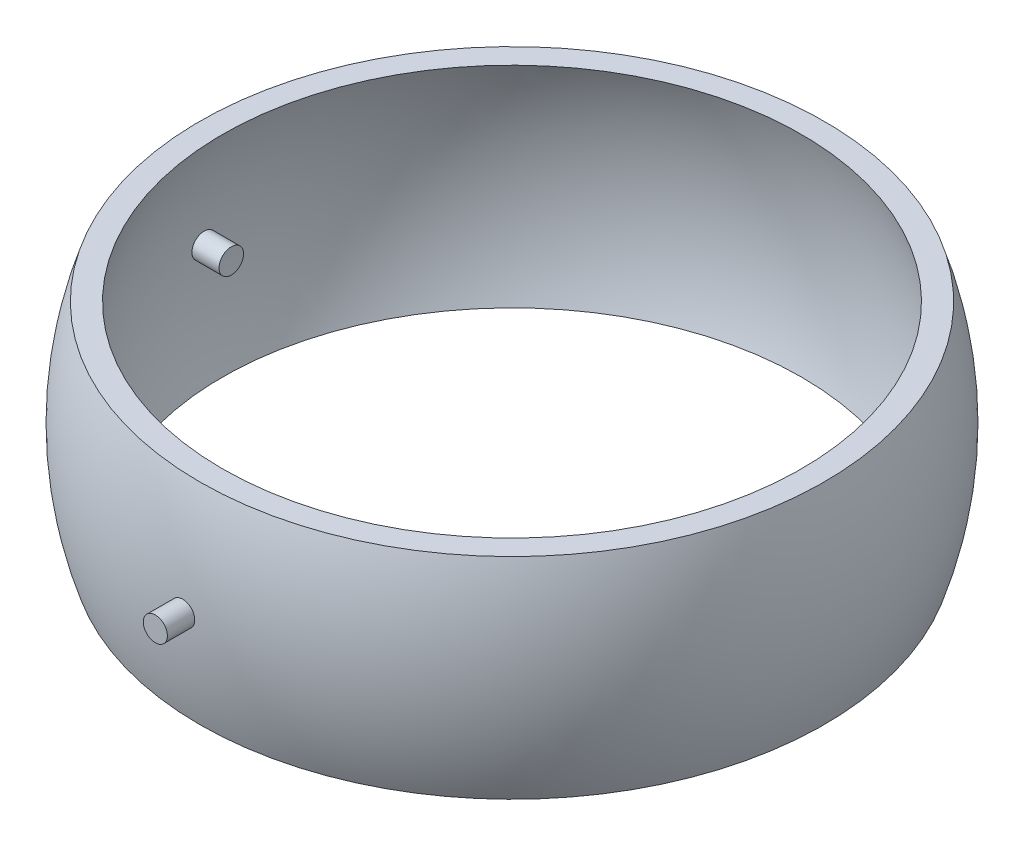
ISO-10303-21;
HEADER;
FILE_DESCRIPTION(('STEP AP214'),'2;1');
FILE_NAME('part.step','',(''),(''),'','','');
FILE_SCHEMA(('AUTOMOTIVE_DESIGN { 1 0 10303 214 1 1 1 1 }'));
ENDSEC;
DATA;
#1=APPLICATION_CONTEXT('core data for automotive mechanical design processes');
#2=APPLICATION_PROTOCOL_DEFINITION('international standard','automotive_design',2000,#1);
#3=PRODUCT_CONTEXT('',#1,'mechanical');
#4=PRODUCT('Part','Part','',(#3));
#5=PRODUCT_RELATED_PRODUCT_CATEGORY('part','',(#4));
#6=PRODUCT_DEFINITION_FORMATION('','',#4);
#7=PRODUCT_DEFINITION_CONTEXT('part definition',#1,'design');
#8=PRODUCT_DEFINITION('design','',#6,#7);
#9=PRODUCT_DEFINITION_SHAPE('','',#8);
#10=(LENGTH_UNIT() NAMED_UNIT(*) SI_UNIT(.MILLI.,.METRE.));
#11=(NAMED_UNIT(*) PLANE_ANGLE_UNIT() SI_UNIT($,.RADIAN.));
#12=(NAMED_UNIT(*) SI_UNIT($,.STERADIAN.) SOLID_ANGLE_UNIT());
#13=UNCERTAINTY_MEASURE_WITH_UNIT(LENGTH_MEASURE(1.E-05),#10,'distance_accuracy_value','');
#14=(GEOMETRIC_REPRESENTATION_CONTEXT(3) GLOBAL_UNCERTAINTY_ASSIGNED_CONTEXT((#13)) GLOBAL_UNIT_ASSIGNED_CONTEXT((#10,
#11,#12)) REPRESENTATION_CONTEXT('',''));
#15=CARTESIAN_POINT('',(0.,0.,0.));
#16=DIRECTION('',(0.,0.,1.));
#17=DIRECTION('',(1.,0.,0.));
#18=AXIS2_PLACEMENT_3D('',#15,#16,#17);
#19=CARTESIAN_POINT('',(1816.481,0.,0.));
#20=DIRECTION('',(-1.,0.,0.));
#21=DIRECTION('',(0.,0.,1.));
#22=AXIS2_PLACEMENT_3D('',#19,#20,#21);
#23=CYLINDRICAL_SURFACE('',#22,71.12);
#24=CARTESIAN_POINT('',(-1628.23979652087,0.,0.));
#25=DIRECTION('',(1.,0.,0.));
#26=DIRECTION('',(0.,0.,-1.));
#27=AXIS2_PLACEMENT_3D('',#24,#25,#26);
#28=CIRCLE('',#27,71.12);
#29=CARTESIAN_POINT('',(-1628.23979652087,0.,71.12));
#30=VERTEX_POINT('',#29);
#31=EDGE_CURVE('E144',#30,#30,#28,.F.);
#32=CARTESIAN_POINT('',(-1785.47411566228,0.,0.));
#33=DIRECTION('',(1.,0.,0.));
#34=DIRECTION('',(0.,0.,-1.));
#35=AXIS2_PLACEMENT_3D('',#32,#33,#34);
#36=CIRCLE('',#35,71.12);
#37=CARTESIAN_POINT('',(-1785.47411566228,0.,71.12));
#38=VERTEX_POINT('',#37);
#39=EDGE_CURVE('E54',#38,#38,#36,.T.);
#40=CARTESIAN_POINT('',(-1628.23979652087,0.,71.12));
#41=CARTESIAN_POINT('',(-1629.87765401192,0.,71.12));
#42=CARTESIAN_POINT('',(-1631.51551150298,0.,71.12));
#43=CARTESIAN_POINT('',(-1634.79122648509,0.,71.12));
#44=CARTESIAN_POINT('',(-1636.42908397615,0.,71.12));
#45=CARTESIAN_POINT('',(-1639.70479895826,0.,71.12));
#46=CARTESIAN_POINT('',(-1641.34265644932,0.,71.12));
#47=CARTESIAN_POINT('',(-1644.61837143143,0.,71.12));
#48=CARTESIAN_POINT('',(-1646.25622892249,0.,71.12));
#49=CARTESIAN_POINT('',(-1649.5319439046,0.,71.12));
#50=CARTESIAN_POINT('',(-1651.16980139566,0.,71.12));
#51=CARTESIAN_POINT('',(-1654.44551637777,0.,71.12));
#52=CARTESIAN_POINT('',(-1656.08337386883,0.,71.12));
#53=CARTESIAN_POINT('',(-1659.35908885094,0.,71.12));
#54=CARTESIAN_POINT('',(-1660.996946342,0.,71.12));
#55=CARTESIAN_POINT('',(-1664.27266132411,0.,71.12));
#56=CARTESIAN_POINT('',(-1665.91051881516,0.,71.12));
#57=CARTESIAN_POINT('',(-1669.18623379728,0.,71.12));
#58=CARTESIAN_POINT('',(-1670.82409128833,0.,71.12));
#59=CARTESIAN_POINT('',(-1674.09980627045,0.,71.12));
#60=CARTESIAN_POINT('',(-1675.7376637615,0.,71.12));
#61=CARTESIAN_POINT('',(-1679.01337874362,0.,71.12));
#62=CARTESIAN_POINT('',(-1680.65123623467,0.,71.12));
#63=CARTESIAN_POINT('',(-1683.92695121678,0.,71.12));
#64=CARTESIAN_POINT('',(-1685.56480870784,0.,71.12));
#65=CARTESIAN_POINT('',(-1688.84052368995,0.,71.12));
#66=CARTESIAN_POINT('',(-1690.47838118101,0.,71.12));
#67=CARTESIAN_POINT('',(-1693.75409616312,0.,71.12));
#68=CARTESIAN_POINT('',(-1695.39195365418,0.,71.12));
#69=CARTESIAN_POINT('',(-1698.66766863629,0.,71.12));
#70=CARTESIAN_POINT('',(-1700.30552612735,0.,71.12));
#71=CARTESIAN_POINT('',(-1703.58124110946,0.,71.12));
#72=CARTESIAN_POINT('',(-1705.21909860052,0.,71.12));
#73=CARTESIAN_POINT('',(-1708.49481358263,0.,71.12));
#74=CARTESIAN_POINT('',(-1710.13267107369,0.,71.12));
#75=CARTESIAN_POINT('',(-1713.4083860558,0.,71.12));
#76=CARTESIAN_POINT('',(-1715.04624354686,0.,71.12));
#77=CARTESIAN_POINT('',(-1718.32195852897,0.,71.12));
#78=CARTESIAN_POINT('',(-1719.95981602002,0.,71.12));
#79=CARTESIAN_POINT('',(-1723.23553100214,0.,71.12));
#80=CARTESIAN_POINT('',(-1724.87338849319,0.,71.12));
#81=CARTESIAN_POINT('',(-1728.14910347531,0.,71.12));
#82=CARTESIAN_POINT('',(-1729.78696096636,0.,71.12));
#83=CARTESIAN_POINT('',(-1733.06267594848,0.,71.12));
#84=CARTESIAN_POINT('',(-1734.70053343953,0.,71.12));
#85=CARTESIAN_POINT('',(-1737.97624842164,0.,71.12));
#86=CARTESIAN_POINT('',(-1739.6141059127,0.,71.12));
#87=CARTESIAN_POINT('',(-1742.88982089481,0.,71.12));
#88=CARTESIAN_POINT('',(-1744.52767838587,0.,71.12));
#89=CARTESIAN_POINT('',(-1747.80339336798,0.,71.12));
#90=CARTESIAN_POINT('',(-1749.44125085904,0.,71.12));
#91=CARTESIAN_POINT('',(-1752.71696584115,0.,71.12));
#92=CARTESIAN_POINT('',(-1754.35482333221,0.,71.12));
#93=CARTESIAN_POINT('',(-1757.63053831432,0.,71.12));
#94=CARTESIAN_POINT('',(-1759.26839580538,0.,71.12));
#95=CARTESIAN_POINT('',(-1762.54411078749,0.,71.12));
#96=CARTESIAN_POINT('',(-1764.18196827855,0.,71.12));
#97=CARTESIAN_POINT('',(-1767.45768326066,0.,71.12));
#98=CARTESIAN_POINT('',(-1769.09554075172,0.,71.12));
#99=CARTESIAN_POINT('',(-1772.37125573383,0.,71.12));
#100=CARTESIAN_POINT('',(-1774.00911322488,0.,71.12));
#101=CARTESIAN_POINT('',(-1777.284828207,0.,71.12));
#102=CARTESIAN_POINT('',(-1778.92268569805,0.,71.12));
#103=CARTESIAN_POINT('',(-1782.19840068017,0.,71.12));
#104=CARTESIAN_POINT('',(-1783.83625817122,0.,71.12));
#105=CARTESIAN_POINT('',(-1785.47411566228,0.,71.12));
#106=B_SPLINE_CURVE_WITH_KNOTS('',3,(#40,#41,#42,#43,#44,#45,#46,#47,#48,#49,#50,#51,#52,#53,
#54,#55,#56,#57,#58,#59,#60,#61,#62,#63,#64,#65,#66,#67,#68,#69,#70,#71,#72,#73,#74,#75,#76,#77,
#78,#79,#80,#81,#82,#83,#84,#85,#86,#87,#88,#89,#90,#91,#92,#93,#94,#95,#96,#97,#98,#99,#100,
#101,#102,#103,#104,#105),.UNSPECIFIED.,.F.,.F.,(4,2,2,2,2,2,2,2,2,2,2,2,2,2,2,2,2,2,2,2,2,2,2,
2,2,2,2,2,2,2,2,2,4),(0.,4.91357247316904,9.82714494633807,14.7407174195071,19.6542898926761,
24.5678623658456,29.4814348390147,34.3950073121837,39.3085797853527,44.2221522585218,
49.1357247316908,54.0492972048598,58.9628696780293,63.8764421511984,68.7900146243674,
73.7035870975364,78.6171595707055,83.5307320438745,88.4443045170435,93.3578769902126,
98.2714494633816,103.185021936551,108.09859440972,113.012166882889,117.925739356058,
122.839311829227,127.752884302396,132.666456775565,137.580029248735,142.493601721904,
147.407174195073,152.320746668242,157.234319141411),.UNSPECIFIED.);
#107=EDGE_CURVE('BSEAM37',#30,#38,#106,.T.);
#108=ORIENTED_EDGE('',*,*,#31,.T.);
#109=ORIENTED_EDGE('',*,*,#39,.T.);
#110=ORIENTED_EDGE('',*,*,#107,.T.);
#111=ORIENTED_EDGE('',*,*,#107,.F.);
#112=EDGE_LOOP('',(#108,#110,#109,#111));
#113=FACE_BOUND('',#112,.T.);
#114=ADVANCED_FACE('F37',(#113),#23,.T.);
#115=CARTESIAN_POINT('',(0.,0.,0.));
#116=DIRECTION('',(0.,1.,0.));
#117=DIRECTION('',(0.,0.,1.));
#118=AXIS2_PLACEMENT_3D('',#115,#116,#117);
#119=SPHERICAL_SURFACE('',#118,1786.89);
#120=CARTESIAN_POINT('',(0.,609.6,0.));
#121=DIRECTION('',(0.,1.,0.));
#122=DIRECTION('',(0.,0.,1.));
#123=AXIS2_PLACEMENT_3D('',#120,#121,#122);
#124=CIRCLE('',#123,1679.69155266674);
#125=CARTESIAN_POINT('',(0.,609.6,1679.69155266674));
#126=VERTEX_POINT('',#125);
#127=EDGE_CURVE('E55',#126,#126,#124,.T.);
#128=ORIENTED_EDGE('',*,*,#127,.T.);
#129=EDGE_LOOP('',(#128));
#130=FACE_BOUND('',#129,.T.);
#131=CARTESIAN_POINT('',(0.,-609.6,0.));
#132=DIRECTION('',(0.,-1.,0.));
#133=DIRECTION('',(0.,0.,-1.));
#134=AXIS2_PLACEMENT_3D('',#131,#132,#133);
#135=CIRCLE('',#134,1679.69155266674);
#136=CARTESIAN_POINT('',(0.,-609.6,-1679.69155266674));
#137=VERTEX_POINT('',#136);
#138=EDGE_CURVE('E41',#137,#137,#135,.T.);
#139=ORIENTED_EDGE('',*,*,#138,.T.);
#140=EDGE_LOOP('',(#139));
#141=FACE_BOUND('',#140,.T.);
#142=CARTESIAN_POINT('',(1785.47411566228,0.,0.));
#143=DIRECTION('',(-1.,0.,0.));
#144=DIRECTION('',(0.,0.,1.));
#145=AXIS2_PLACEMENT_3D('',#142,#143,#144);
#146=CIRCLE('',#145,71.12);
#147=CARTESIAN_POINT('',(1785.47411566228,0.,71.12));
#148=VERTEX_POINT('',#147);
#149=EDGE_CURVE('E10',#148,#148,#146,.T.);
#150=ORIENTED_EDGE('',*,*,#149,.F.);
#151=EDGE_LOOP('',(#150));
#152=FACE_BOUND('',#151,.T.);
#153=ORIENTED_EDGE('',*,*,#39,.F.);
#154=EDGE_LOOP('',(#153));
#155=FACE_BOUND('',#154,.T.);
#156=ADVANCED_FACE('F95',(#130,#141,#152,#155),#119,.F.);
#157=CARTESIAN_POINT('',(0.,0.,0.));
#158=DIRECTION('',(0.,1.,0.));
#159=DIRECTION('',(-1.,0.,0.));
#160=AXIS2_PLACEMENT_3D('',#157,#158,#159);
#161=SPHERICAL_SURFACE('',#160,1911.35);
#162=CARTESIAN_POINT('',(0.,0.,1910.07324466891));
#163=DIRECTION('',(0.,0.,-1.));
#164=DIRECTION('',(-1.,0.,0.));
#165=AXIS2_PLACEMENT_3D('',#162,#163,#164);
#166=CIRCLE('',#165,69.85);
#167=CARTESIAN_POINT('',(-69.85,0.,1910.07324466891));
#168=VERTEX_POINT('',#167);
#169=EDGE_CURVE('E68',#168,#168,#166,.T.);
#170=ORIENTED_EDGE('',*,*,#169,.T.);
#171=EDGE_LOOP('',(#170));
#172=FACE_BOUND('',#171,.T.);
#173=CARTESIAN_POINT('',(0.,-609.6,0.));
#174=DIRECTION('',(0.,1.,0.));
#175=DIRECTION('',(0.,0.,1.));
#176=AXIS2_PLACEMENT_3D('',#173,#174,#175);
#177=CIRCLE('',#176,1811.53157921688);
#178=CARTESIAN_POINT('',(0.,-609.6,1811.53157921688));
#179=VERTEX_POINT('',#178);
#180=EDGE_CURVE('E64',#179,#179,#177,.T.);
#181=ORIENTED_EDGE('',*,*,#180,.T.);
#182=EDGE_LOOP('',(#181));
#183=FACE_BOUND('',#182,.T.);
#184=CARTESIAN_POINT('',(0.,609.6,0.));
#185=DIRECTION('',(0.,1.,0.));
#186=DIRECTION('',(0.,0.,1.));
#187=AXIS2_PLACEMENT_3D('',#184,#185,#186);
#188=CIRCLE('',#187,1811.53157921688);
#189=CARTESIAN_POINT('',(0.,609.6,1811.53157921688));
#190=VERTEX_POINT('',#189);
#191=EDGE_CURVE('E61',#190,#190,#188,.T.);
#192=ORIENTED_EDGE('',*,*,#191,.F.);
#193=EDGE_LOOP('',(#192));
#194=FACE_BOUND('',#193,.T.);
#195=CARTESIAN_POINT('',(0.,0.,-1910.07324466891));
#196=DIRECTION('',(0.,0.,1.));
#197=DIRECTION('',(1.,0.,0.));
#198=AXIS2_PLACEMENT_3D('',#195,#196,#197);
#199=CIRCLE('',#198,69.85);
#200=CARTESIAN_POINT('',(69.85,0.,-1910.07324466891));
#201=VERTEX_POINT('',#200);
#202=EDGE_CURVE('E67',#201,#201,#199,.T.);
#203=ORIENTED_EDGE('',*,*,#202,.T.);
#204=EDGE_LOOP('',(#203));
#205=FACE_BOUND('',#204,.T.);
#206=ADVANCED_FACE('F75',(#172,#183,#194,#205),#161,.T.);
#207=CARTESIAN_POINT('',(-1676.98919570163,609.6,0.));
#208=DIRECTION('',(0.,1.,0.));
#209=DIRECTION('',(0.,0.,1.));
#210=AXIS2_PLACEMENT_3D('',#207,#208,#209);
#211=PLANE('',#210);
#212=ORIENTED_EDGE('',*,*,#127,.F.);
#213=EDGE_LOOP('',(#212));
#214=FACE_BOUND('',#213,.T.);
#215=ORIENTED_EDGE('',*,*,#191,.T.);
#216=EDGE_LOOP('',(#215));
#217=FACE_BOUND('',#216,.T.);
#218=ADVANCED_FACE('F118',(#214,#217),#211,.T.);
#219=CARTESIAN_POINT('',(-1811.53157921688,-609.6,0.));
#220=DIRECTION('',(0.,-1.,0.));
#221=DIRECTION('',(0.,0.,-1.));
#222=AXIS2_PLACEMENT_3D('',#219,#220,#221);
#223=PLANE('',#222);
#224=ORIENTED_EDGE('',*,*,#138,.F.);
#225=EDGE_LOOP('',(#224));
#226=FACE_BOUND('',#225,.T.);
#227=ORIENTED_EDGE('',*,*,#180,.F.);
#228=EDGE_LOOP('',(#227));
#229=FACE_BOUND('',#228,.T.);
#230=ADVANCED_FACE('F121',(#226,#229),#223,.T.);
#231=CARTESIAN_POINT('',(0.,0.,2068.83));
#232=DIRECTION('',(0.,0.,1.));
#233=DIRECTION('',(1.,0.,0.));
#234=AXIS2_PLACEMENT_3D('',#231,#232,#233);
#235=PLANE('',#234);
#236=CARTESIAN_POINT('',(0.,0.,2068.83));
#237=DIRECTION('',(0.,0.,1.));
#238=DIRECTION('',(1.,0.,0.));
#239=AXIS2_PLACEMENT_3D('',#236,#237,#238);
#240=CIRCLE('',#239,69.85);
#241=CARTESIAN_POINT('',(69.85,0.,2068.83));
#242=VERTEX_POINT('',#241);
#243=EDGE_CURVE('E58',#242,#242,#240,.T.);
#244=ORIENTED_EDGE('',*,*,#243,.T.);
#245=EDGE_LOOP('',(#244));
#246=FACE_BOUND('',#245,.T.);
#247=ADVANCED_FACE('F90',(#246),#235,.T.);
#248=CARTESIAN_POINT('',(0.,0.,2068.83));
#249=DIRECTION('',(0.,0.,-1.));
#250=DIRECTION('',(-1.,0.,0.));
#251=AXIS2_PLACEMENT_3D('',#248,#249,#250);
#252=CYLINDRICAL_SURFACE('',#251,69.85);
#253=ORIENTED_EDGE('',*,*,#169,.F.);
#254=EDGE_LOOP('',(#253));
#255=FACE_BOUND('',#254,.T.);
#256=ORIENTED_EDGE('',*,*,#243,.F.);
#257=EDGE_LOOP('',(#256));
#258=FACE_BOUND('',#257,.T.);
#259=ADVANCED_FACE('F82',(#255,#258),#252,.T.);
#260=CARTESIAN_POINT('',(0.,0.,-2068.83));
#261=DIRECTION('',(0.,0.,1.));
#262=DIRECTION('',(1.,0.,0.));
#263=AXIS2_PLACEMENT_3D('',#260,#261,#262);
#264=PLANE('',#263);
#265=CARTESIAN_POINT('',(0.,0.,-2068.83));
#266=DIRECTION('',(0.,0.,1.));
#267=DIRECTION('',(1.,0.,0.));
#268=AXIS2_PLACEMENT_3D('',#265,#266,#267);
#269=CIRCLE('',#268,69.85);
#270=CARTESIAN_POINT('',(69.85,0.,-2068.83));
#271=VERTEX_POINT('',#270);
#272=EDGE_CURVE('E50',#271,#271,#269,.T.);
#273=ORIENTED_EDGE('',*,*,#272,.F.);
#274=EDGE_LOOP('',(#273));
#275=FACE_BOUND('',#274,.T.);
#276=ADVANCED_FACE('F80',(#275),#264,.F.);
#277=ORIENTED_EDGE('',*,*,#202,.F.);
#278=EDGE_LOOP('',(#277));
#279=FACE_BOUND('',#278,.T.);
#280=ORIENTED_EDGE('',*,*,#272,.T.);
#281=EDGE_LOOP('',(#280));
#282=FACE_BOUND('',#281,.T.);
#283=ADVANCED_FACE('F77',(#279,#282),#252,.T.);
#284=CARTESIAN_POINT('',(1628.23979652087,0.,0.));
#285=DIRECTION('',(-1.,0.,0.));
#286=DIRECTION('',(0.,0.,1.));
#287=AXIS2_PLACEMENT_3D('',#284,#285,#286);
#288=CIRCLE('',#287,71.12);
#289=CARTESIAN_POINT('',(1628.23979652087,0.,71.12));
#290=VERTEX_POINT('',#289);
#291=EDGE_CURVE('E45',#290,#290,#288,.F.);
#292=CARTESIAN_POINT('',(1628.23979652087,0.,71.12));
#293=CARTESIAN_POINT('',(1629.87765401193,0.,71.12));
#294=CARTESIAN_POINT('',(1631.51551150298,0.,71.12));
#295=CARTESIAN_POINT('',(1634.79122648509,0.,71.12));
#296=CARTESIAN_POINT('',(1636.42908397615,0.,71.12));
#297=CARTESIAN_POINT('',(1639.70479895826,0.,71.12));
#298=CARTESIAN_POINT('',(1641.34265644932,0.,71.12));
#299=CARTESIAN_POINT('',(1644.61837143143,0.,71.12));
#300=CARTESIAN_POINT('',(1646.25622892249,0.,71.12));
#301=CARTESIAN_POINT('',(1649.5319439046,0.,71.12));
#302=CARTESIAN_POINT('',(1651.16980139566,0.,71.12));
#303=CARTESIAN_POINT('',(1654.44551637777,0.,71.12));
#304=CARTESIAN_POINT('',(1656.08337386883,0.,71.12));
#305=CARTESIAN_POINT('',(1659.35908885094,0.,71.12));
#306=CARTESIAN_POINT('',(1660.996946342,0.,71.12));
#307=CARTESIAN_POINT('',(1664.27266132411,0.,71.12));
#308=CARTESIAN_POINT('',(1665.91051881517,0.,71.12));
#309=CARTESIAN_POINT('',(1669.18623379728,0.,71.12));
#310=CARTESIAN_POINT('',(1670.82409128833,0.,71.12));
#311=CARTESIAN_POINT('',(1674.09980627045,0.,71.12));
#312=CARTESIAN_POINT('',(1675.7376637615,0.,71.12));
#313=CARTESIAN_POINT('',(1679.01337874362,0.,71.12));
#314=CARTESIAN_POINT('',(1680.65123623467,0.,71.12));
#315=CARTESIAN_POINT('',(1683.92695121679,0.,71.12));
#316=CARTESIAN_POINT('',(1685.56480870784,0.,71.12));
#317=CARTESIAN_POINT('',(1688.84052368995,0.,71.12));
#318=CARTESIAN_POINT('',(1690.47838118101,0.,71.12));
#319=CARTESIAN_POINT('',(1693.75409616312,0.,71.12));
#320=CARTESIAN_POINT('',(1695.39195365418,0.,71.12));
#321=CARTESIAN_POINT('',(1698.66766863629,0.,71.12));
#322=CARTESIAN_POINT('',(1700.30552612735,0.,71.12));
#323=CARTESIAN_POINT('',(1703.58124110946,0.,71.12));
#324=CARTESIAN_POINT('',(1705.21909860052,0.,71.12));
#325=CARTESIAN_POINT('',(1708.49481358263,0.,71.12));
#326=CARTESIAN_POINT('',(1710.13267107369,0.,71.12));
#327=CARTESIAN_POINT('',(1713.4083860558,0.,71.12));
#328=CARTESIAN_POINT('',(1715.04624354686,0.,71.12));
#329=CARTESIAN_POINT('',(1718.32195852897,0.,71.12));
#330=CARTESIAN_POINT('',(1719.95981602003,0.,71.12));
#331=CARTESIAN_POINT('',(1723.23553100214,0.,71.12));
#332=CARTESIAN_POINT('',(1724.87338849319,0.,71.12));
#333=CARTESIAN_POINT('',(1728.14910347531,0.,71.12));
#334=CARTESIAN_POINT('',(1729.78696096636,0.,71.12));
#335=CARTESIAN_POINT('',(1733.06267594848,0.,71.12));
#336=CARTESIAN_POINT('',(1734.70053343953,0.,71.12));
#337=CARTESIAN_POINT('',(1737.97624842165,0.,71.12));
#338=CARTESIAN_POINT('',(1739.6141059127,0.,71.12));
#339=CARTESIAN_POINT('',(1742.88982089481,0.,71.12));
#340=CARTESIAN_POINT('',(1744.52767838587,0.,71.12));
#341=CARTESIAN_POINT('',(1747.80339336798,0.,71.12));
#342=CARTESIAN_POINT('',(1749.44125085904,0.,71.12));
#343=CARTESIAN_POINT('',(1752.71696584115,0.,71.12));
#344=CARTESIAN_POINT('',(1754.35482333221,0.,71.12));
#345=CARTESIAN_POINT('',(1757.63053831432,0.,71.12));
#346=CARTESIAN_POINT('',(1759.26839580538,0.,71.12));
#347=CARTESIAN_POINT('',(1762.54411078749,0.,71.12));
#348=CARTESIAN_POINT('',(1764.18196827855,0.,71.12));
#349=CARTESIAN_POINT('',(1767.45768326066,0.,71.12));
#350=CARTESIAN_POINT('',(1769.09554075172,0.,71.12));
#351=CARTESIAN_POINT('',(1772.37125573383,0.,71.12));
#352=CARTESIAN_POINT('',(1774.00911322489,0.,71.12));
#353=CARTESIAN_POINT('',(1777.284828207,0.,71.12));
#354=CARTESIAN_POINT('',(1778.92268569805,0.,71.12));
#355=CARTESIAN_POINT('',(1782.19840068017,0.,71.12));
#356=CARTESIAN_POINT('',(1783.83625817122,0.,71.12));
#357=CARTESIAN_POINT('',(1785.47411566228,0.,71.12));
#358=B_SPLINE_CURVE_WITH_KNOTS('',3,(#292,#293,#294,#295,#296,#297,#298,#299,#300,#301,#302,
#303,#304,#305,#306,#307,#308,#309,#310,#311,#312,#313,#314,#315,#316,#317,#318,#319,#320,#321,
#322,#323,#324,#325,#326,#327,#328,#329,#330,#331,#332,#333,#334,#335,#336,#337,#338,#339,#340,
#341,#342,#343,#344,#345,#346,#347,#348,#349,#350,#351,#352,#353,#354,#355,#356,#357),
.UNSPECIFIED.,.F.,.F.,(4,2,2,2,2,2,2,2,2,2,2,2,2,2,2,2,2,2,2,2,2,2,2,2,2,2,2,2,2,2,2,2,4),(0.,
4.91357247316904,9.82714494633807,14.7407174195071,19.6542898926761,24.5678623658454,
29.4814348390144,34.3950073121835,39.3085797853525,44.2221522585216,49.1357247316906,
54.0492972048598,58.9628696780289,63.8764421511979,68.790014624367,73.703587097536,
78.6171595707053,83.5307320438743,88.4443045170433,93.3578769902124,98.2714494633814,
103.18502193655,108.09859440972,113.012166882889,117.925739356058,122.839311829227,
127.752884302396,132.666456775565,137.580029248734,142.493601721903,147.407174195072,
152.320746668241,157.234319141411),.UNSPECIFIED.);
#359=EDGE_CURVE('BSEAM39',#290,#148,#358,.T.);
#360=ORIENTED_EDGE('',*,*,#291,.T.);
#361=ORIENTED_EDGE('',*,*,#149,.T.);
#362=ORIENTED_EDGE('',*,*,#359,.T.);
#363=ORIENTED_EDGE('',*,*,#359,.F.);
#364=EDGE_LOOP('',(#360,#362,#361,#363));
#365=FACE_BOUND('',#364,.T.);
#366=ADVANCED_FACE('F39',(#365),#23,.T.);
#367=CARTESIAN_POINT('',(0.,0.,0.));
#368=DIRECTION('',(0.,1.,0.));
#369=DIRECTION('',(-1.,0.,0.));
#370=AXIS2_PLACEMENT_3D('',#367,#368,#369);
#371=SPHERICAL_SURFACE('',#370,1629.79228411915);
#372=CARTESIAN_POINT('',(0.,0.,0.));
#373=DIRECTION('',(-1.,0.,0.));
#374=DIRECTION('',(0.,0.,1.));
#375=AXIS2_PLACEMENT_3D('',#372,#373,#374);
#376=SPHERICAL_SURFACE('',#375,1629.79228411915);
#377=ORIENTED_EDGE('',*,*,#291,.F.);
#378=EDGE_LOOP('',(#377));
#379=FACE_BOUND('',#378,.T.);
#380=ADVANCED_FACE('F105',(#379),#376,.F.);
#381=CARTESIAN_POINT('',(0.,0.,0.));
#382=DIRECTION('',(1.,0.,0.));
#383=DIRECTION('',(0.,0.,-1.));
#384=AXIS2_PLACEMENT_3D('',#381,#382,#383);
#385=SPHERICAL_SURFACE('',#384,1629.79228411915);
#386=ORIENTED_EDGE('',*,*,#31,.F.);
#387=EDGE_LOOP('',(#386));
#388=FACE_BOUND('',#387,.T.);
#389=ADVANCED_FACE('F110',(#388),#385,.F.);
#390=CLOSED_SHELL('',(#114,#156,#206,#218,#230,#247,#259,#276,#283,#366,#380,#389));
#391=MANIFOLD_SOLID_BREP('B2',#390);
#392=ADVANCED_BREP_SHAPE_REPRESENTATION('',(#18,#391),#14);
#393=SHAPE_DEFINITION_REPRESENTATION(#9,#392);
ENDSEC;
END-ISO-10303-21;
